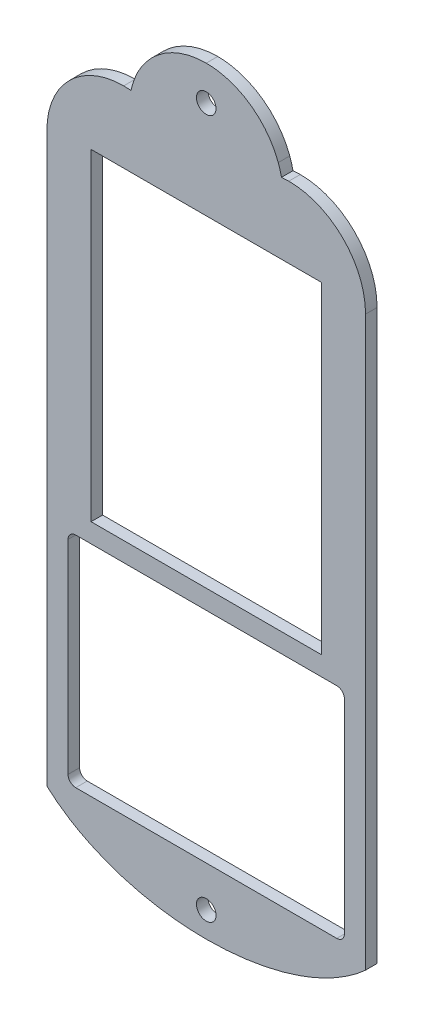
ISO-10303-21;
HEADER;
FILE_DESCRIPTION(('STEP AP214'),'2;1');
FILE_NAME('part.step','',(''),(''),'','','');
FILE_SCHEMA(('AUTOMOTIVE_DESIGN { 1 0 10303 214 1 1 1 1 }'));
ENDSEC;
DATA;
#1=APPLICATION_CONTEXT('core data for automotive mechanical design processes');
#2=APPLICATION_PROTOCOL_DEFINITION('international standard','automotive_design',2000,#1);
#3=PRODUCT_CONTEXT('',#1,'mechanical');
#4=PRODUCT('Part','Part','',(#3));
#5=PRODUCT_RELATED_PRODUCT_CATEGORY('part','',(#4));
#6=PRODUCT_DEFINITION_FORMATION('','',#4);
#7=PRODUCT_DEFINITION_CONTEXT('part definition',#1,'design');
#8=PRODUCT_DEFINITION('design','',#6,#7);
#9=PRODUCT_DEFINITION_SHAPE('','',#8);
#10=(LENGTH_UNIT() NAMED_UNIT(*) SI_UNIT(.MILLI.,.METRE.));
#11=(NAMED_UNIT(*) PLANE_ANGLE_UNIT() SI_UNIT($,.RADIAN.));
#12=(NAMED_UNIT(*) SI_UNIT($,.STERADIAN.) SOLID_ANGLE_UNIT());
#13=UNCERTAINTY_MEASURE_WITH_UNIT(LENGTH_MEASURE(1.E-05),#10,'distance_accuracy_value','');
#14=(GEOMETRIC_REPRESENTATION_CONTEXT(3) GLOBAL_UNCERTAINTY_ASSIGNED_CONTEXT((#13)) GLOBAL_UNIT_ASSIGNED_CONTEXT((#10,
#11,#12)) REPRESENTATION_CONTEXT('',''));
#15=CARTESIAN_POINT('',(0.,0.,0.));
#16=DIRECTION('',(0.,0.,1.));
#17=DIRECTION('',(1.,0.,0.));
#18=AXIS2_PLACEMENT_3D('',#15,#16,#17);
#19=CARTESIAN_POINT('',(-7.6058350285354,82.2924326123432,3.));
#20=DIRECTION('',(0.,0.,-1.));
#21=DIRECTION('',(-1.,0.,0.));
#22=AXIS2_PLACEMENT_3D('',#19,#20,#21);
#23=PLANE('',#22);
#24=DIRECTION('',(0.,-1.,0.));
#25=VECTOR('',#24,1.);
#26=CARTESIAN_POINT('',(-73.2491831836532,69.5718591249572,3.));
#27=LINE('',#26,#25);
#28=CARTESIAN_POINT('',(-73.2491831836532,69.5718591249572,3.));
#29=VERTEX_POINT('',#28);
#30=CARTESIAN_POINT('',(-73.2491831836531,-14.4281408750428,3.));
#31=VERTEX_POINT('',#30);
#32=EDGE_CURVE('E682',#29,#31,#27,.T.);
#33=ORIENTED_EDGE('',*,*,#32,.F.);
#34=DIRECTION('',(-1.,0.,0.));
#35=VECTOR('',#34,1.);
#36=CARTESIAN_POINT('',(-73.2491831836532,69.5718591249572,3.));
#37=LINE('',#36,#35);
#38=CARTESIAN_POINT('',(-13.2491831836531,69.5718591249572,3.));
#39=VERTEX_POINT('',#38);
#40=EDGE_CURVE('E692',#39,#29,#37,.T.);
#41=ORIENTED_EDGE('',*,*,#40,.F.);
#42=DIRECTION('',(0.,1.,0.));
#43=VECTOR('',#42,1.);
#44=CARTESIAN_POINT('',(-13.2491831836531,69.5718591249572,3.));
#45=LINE('',#44,#43);
#46=CARTESIAN_POINT('',(-13.2491831836531,-14.4281408750428,3.));
#47=VERTEX_POINT('',#46);
#48=EDGE_CURVE('E697',#47,#39,#45,.T.);
#49=ORIENTED_EDGE('',*,*,#48,.F.);
#50=DIRECTION('',(1.,0.,0.));
#51=VECTOR('',#50,1.);
#52=CARTESIAN_POINT('',(-73.2491831836531,-14.4281408750428,3.));
#53=LINE('',#52,#51);
#54=EDGE_CURVE('E685',#31,#47,#53,.T.);
#55=ORIENTED_EDGE('',*,*,#54,.F.);
#56=EDGE_LOOP('',(#33,#41,#49,#55));
#57=FACE_BOUND('',#56,.T.);
#58=CARTESIAN_POINT('',(-1.74840024860734,68.1508943137749,3.));
#59=CARTESIAN_POINT('',(-1.74840024860734,79.1963656719619,3.));
#60=CARTESIAN_POINT('',(-10.7019019689167,88.1498673922713,3.));
#61=CARTESIAN_POINT('',(-21.7473733271037,88.1498673922713,3.));
#62=B_SPLINE_CURVE_WITH_KNOTS('',3,(#58,#59,#60,#61),.UNSPECIFIED.,.F.,.F.,(4,4),(0.,1.),.UNSPECIFIED.);
#63=CARTESIAN_POINT('',(-1.74840024860734,68.1508943137749,3.));
#64=VERTEX_POINT('',#63);
#65=CARTESIAN_POINT('',(-21.7473733271037,88.1498673922713,3.));
#66=VERTEX_POINT('',#65);
#67=EDGE_CURVE('E293',#64,#66,#62,.T.);
#68=ORIENTED_EDGE('',*,*,#67,.T.);
#69=CARTESIAN_POINT('',(-21.7473733271037,88.1498673922713,3.));
#70=CARTESIAN_POINT('',(-22.3894314663204,88.1498673922713,3.));
#71=CARTESIAN_POINT('',(-23.0279583826646,88.1181294501134,3.));
#72=CARTESIAN_POINT('',(-23.6559131622385,88.0581417249765,3.));
#73=B_SPLINE_CURVE_WITH_KNOTS('',3,(#69,#70,#71,#72),.UNSPECIFIED.,.F.,.F.,(4,4),(1.,2.),.UNSPECIFIED.);
#74=CARTESIAN_POINT('',(-23.6559131622385,88.0581417249765,3.));
#75=VERTEX_POINT('',#74);
#76=EDGE_CURVE('E300',#66,#75,#73,.T.);
#77=ORIENTED_EDGE('',*,*,#76,.T.);
#78=CARTESIAN_POINT('',(-23.6559131622385,88.0581417249765,3.));
#79=CARTESIAN_POINT('',(-23.8605087703688,89.0565088647551,3.));
#80=CARTESIAN_POINT('',(-24.1427482179979,90.0301789762739,3.));
#81=CARTESIAN_POINT('',(-24.4884635499427,90.9720896137879,3.));
#82=B_SPLINE_CURVE_WITH_KNOTS('',3,(#78,#79,#80,#81),.UNSPECIFIED.,.F.,.F.,(4,4),(2.,3.),.UNSPECIFIED.);
#83=CARTESIAN_POINT('',(-24.4884635499427,90.9720896137879,3.));
#84=VERTEX_POINT('',#83);
#85=EDGE_CURVE('E319',#75,#84,#82,.T.);
#86=ORIENTED_EDGE('',*,*,#85,.T.);
#87=CARTESIAN_POINT('',(-24.4884635499427,90.9720896137879,3.));
#88=CARTESIAN_POINT('',(-27.3106857714594,98.592102530991,3.));
#89=CARTESIAN_POINT('',(-34.644928018161,104.024867388303,3.));
#90=CARTESIAN_POINT('',(-43.2491831836531,104.024867388303,3.));
#91=B_SPLINE_CURVE_WITH_KNOTS('',3,(#87,#88,#89,#90),.UNSPECIFIED.,.F.,.F.,(4,4),(3.,4.),.UNSPECIFIED.);
#92=CARTESIAN_POINT('',(-43.2491831836531,104.024867388303,3.));
#93=VERTEX_POINT('',#92);
#94=EDGE_CURVE('E324',#84,#93,#91,.T.);
#95=ORIENTED_EDGE('',*,*,#94,.T.);
#96=CARTESIAN_POINT('',(-43.2491831836531,104.024867388303,3.));
#97=CARTESIAN_POINT('',(-51.8534383491453,104.024867388303,3.));
#98=CARTESIAN_POINT('',(-59.1876805958469,98.592102530991,3.));
#99=CARTESIAN_POINT('',(-62.0099028173636,90.9720896137879,3.));
#100=B_SPLINE_CURVE_WITH_KNOTS('',3,(#96,#97,#98,#99),.UNSPECIFIED.,.F.,.F.,(4,4),(4.,5.),.UNSPECIFIED.);
#101=CARTESIAN_POINT('',(-62.0099028173636,90.9720896137879,3.));
#102=VERTEX_POINT('',#101);
#103=EDGE_CURVE('E456',#93,#102,#100,.T.);
#104=ORIENTED_EDGE('',*,*,#103,.T.);
#105=CARTESIAN_POINT('',(-62.0099028173636,90.9720896137879,3.));
#106=CARTESIAN_POINT('',(-62.3556396811552,90.0301789762739,3.));
#107=CARTESIAN_POINT('',(-62.6378575969375,89.0565088647551,3.));
#108=CARTESIAN_POINT('',(-62.8424532050678,88.0581417249765,3.));
#109=B_SPLINE_CURVE_WITH_KNOTS('',3,(#105,#106,#107,#108),.UNSPECIFIED.,.F.,.F.,(4,4),(5.,6.),.UNSPECIFIED.);
#110=CARTESIAN_POINT('',(-62.8424532050678,88.0581417249765,3.));
#111=VERTEX_POINT('',#110);
#112=EDGE_CURVE('E451',#102,#111,#109,.T.);
#113=ORIENTED_EDGE('',*,*,#112,.T.);
#114=CARTESIAN_POINT('',(-62.8424532050678,88.0581417249765,3.));
#115=CARTESIAN_POINT('',(-63.4704079846417,88.1181294501134,3.));
#116=CARTESIAN_POINT('',(-64.1054036781136,88.1498673922713,3.));
#117=CARTESIAN_POINT('',(-64.7474618173302,88.1498673922713,3.));
#118=B_SPLINE_CURVE_WITH_KNOTS('',3,(#114,#115,#116,#117),.UNSPECIFIED.,.F.,.F.,(4,4),(6.,7.),.UNSPECIFIED.);
#119=CARTESIAN_POINT('',(-64.7474618173302,88.1498673922713,3.));
#120=VERTEX_POINT('',#119);
#121=EDGE_CURVE('E438',#111,#120,#118,.T.);
#122=ORIENTED_EDGE('',*,*,#121,.T.);
#123=CARTESIAN_POINT('',(-64.7474618173302,88.1498673922713,3.));
#124=CARTESIAN_POINT('',(-75.7964643983896,88.1498673922713,3.));
#125=CARTESIAN_POINT('',(-84.749966118699,79.1963656719619,3.));
#126=CARTESIAN_POINT('',(-84.749966118699,68.1508943137749,3.));
#127=B_SPLINE_CURVE_WITH_KNOTS('',3,(#123,#124,#125,#126),.UNSPECIFIED.,.F.,.F.,(4,4),(7.,8.),.UNSPECIFIED.);
#128=CARTESIAN_POINT('',(-84.749966118699,68.1508943137749,3.));
#129=VERTEX_POINT('',#128);
#130=EDGE_CURVE('E432',#120,#129,#127,.T.);
#131=ORIENTED_EDGE('',*,*,#130,.T.);
#132=DIRECTION('',(0.,-1.,0.));
#133=VECTOR('',#132,1.);
#134=CARTESIAN_POINT('',(-84.749966118699,68.1508943137749,3.));
#135=LINE('',#134,#133);
#136=CARTESIAN_POINT('',(-84.7499661186989,-79.8491056862251,3.));
#137=VERTEX_POINT('',#136);
#138=EDGE_CURVE('E437',#129,#137,#135,.T.);
#139=ORIENTED_EDGE('',*,*,#138,.T.);
#140=CARTESIAN_POINT('',(-84.7499661186989,-79.8491056862251,3.));
#141=CARTESIAN_POINT('',(-81.6384635356552,-82.6924937131293,3.));
#142=CARTESIAN_POINT('',(-77.8178741743599,-85.1972288538334,3.));
#143=CARTESIAN_POINT('',(-73.4469523411428,-87.2680326863235,3.));
#144=B_SPLINE_CURVE_WITH_KNOTS('',3,(#140,#141,#142,#143),.UNSPECIFIED.,.F.,.F.,(4,4),(11.,12.),.UNSPECIFIED.);
#145=CARTESIAN_POINT('',(-73.4469523411428,-87.2680326863235,3.));
#146=VERTEX_POINT('',#145);
#147=EDGE_CURVE('E403',#137,#146,#144,.T.);
#148=ORIENTED_EDGE('',*,*,#147,.T.);
#149=CARTESIAN_POINT('',(-73.4469523411428,-87.2680326863235,3.));
#150=CARTESIAN_POINT('',(-65.0296797331125,-91.2579484907188,3.));
#151=CARTESIAN_POINT('',(-54.5733412347501,-93.618032684736,3.));
#152=CARTESIAN_POINT('',(-43.2491831836531,-93.618032684736,3.));
#153=B_SPLINE_CURVE_WITH_KNOTS('',3,(#149,#150,#151,#152),.UNSPECIFIED.,.F.,.F.,(4,4),(12.,13.),.UNSPECIFIED.);
#154=CARTESIAN_POINT('',(-43.2491831836531,-93.618032684736,3.));
#155=VERTEX_POINT('',#154);
#156=EDGE_CURVE('E398',#146,#155,#153,.T.);
#157=ORIENTED_EDGE('',*,*,#156,.T.);
#158=CARTESIAN_POINT('',(-43.2491831836531,-93.618032684736,3.));
#159=CARTESIAN_POINT('',(-31.9250251325562,-93.618032684736,3.));
#160=CARTESIAN_POINT('',(-21.4686866341937,-91.2579484907188,3.));
#161=CARTESIAN_POINT('',(-13.0514140261635,-87.2680326863235,3.));
#162=B_SPLINE_CURVE_WITH_KNOTS('',3,(#158,#159,#160,#161),.UNSPECIFIED.,.F.,.F.,(4,4),(13.,14.),.UNSPECIFIED.);
#163=CARTESIAN_POINT('',(-13.0514140261635,-87.2680326863235,3.));
#164=VERTEX_POINT('',#163);
#165=EDGE_CURVE('E381',#155,#164,#162,.T.);
#166=ORIENTED_EDGE('',*,*,#165,.T.);
#167=CARTESIAN_POINT('',(-13.0514140261635,-87.2680326863235,3.));
#168=CARTESIAN_POINT('',(-8.68049219294634,-85.1972288538334,3.));
#169=CARTESIAN_POINT('',(-4.85990283165106,-82.6924937131293,3.));
#170=CARTESIAN_POINT('',(-1.74840024860732,-79.8491056862251,3.));
#171=B_SPLINE_CURVE_WITH_KNOTS('',3,(#167,#168,#169,#170),.UNSPECIFIED.,.F.,.F.,(4,4),(14.,15.),.UNSPECIFIED.);
#172=CARTESIAN_POINT('',(-1.74840024860732,-79.8491056862251,3.));
#173=VERTEX_POINT('',#172);
#174=EDGE_CURVE('E374',#164,#173,#171,.T.);
#175=ORIENTED_EDGE('',*,*,#174,.T.);
#176=DIRECTION('',(0.,1.,0.));
#177=VECTOR('',#176,1.);
#178=CARTESIAN_POINT('',(-1.74840024860734,68.1508943137749,3.));
#179=LINE('',#178,#177);
#180=EDGE_CURVE('E380',#173,#64,#179,.T.);
#181=ORIENTED_EDGE('',*,*,#180,.T.);
#182=EDGE_LOOP('',(#68,#77,#86,#95,#104,#113,#122,#131,#139,#148,#157,#166,#175,#181));
#183=FACE_BOUND('',#182,.T.);
#184=CARTESIAN_POINT('',(-43.2491831836531,95.0101030947806,3.));
#185=DIRECTION('',(0.,0.,1.));
#186=DIRECTION('',(1.,0.,0.));
#187=AXIS2_PLACEMENT_3D('',#184,#185,#186);
#188=CIRCLE('',#187,2.55);
#189=CARTESIAN_POINT('',(-40.6991831836531,95.0101030947806,3.));
#190=VERTEX_POINT('',#189);
#191=EDGE_CURVE('E286',#190,#190,#188,.T.);
#192=ORIENTED_EDGE('',*,*,#191,.F.);
#193=EDGE_LOOP('',(#192));
#194=FACE_BOUND('',#193,.T.);
#195=CARTESIAN_POINT('',(-43.2491831836531,-86.9898969052195,3.));
#196=DIRECTION('',(0.,0.,1.));
#197=DIRECTION('',(1.,0.,0.));
#198=AXIS2_PLACEMENT_3D('',#195,#196,#197);
#199=CIRCLE('',#198,2.54999999999999);
#200=CARTESIAN_POINT('',(-40.6991831836532,-86.9898969052195,3.));
#201=VERTEX_POINT('',#200);
#202=EDGE_CURVE('E275',#201,#201,#199,.T.);
#203=ORIENTED_EDGE('',*,*,#202,.F.);
#204=EDGE_LOOP('',(#203));
#205=FACE_BOUND('',#204,.T.);
#206=CARTESIAN_POINT('',(-77.2491831836531,-74.4281408750428,3.));
#207=DIRECTION('',(0.,0.,1.));
#208=DIRECTION('',(1.,0.,0.));
#209=AXIS2_PLACEMENT_3D('',#206,#207,#208);
#210=CIRCLE('',#209,2.);
#211=CARTESIAN_POINT('',(-79.2491831836531,-74.4281408750428,3.));
#212=VERTEX_POINT('',#211);
#213=CARTESIAN_POINT('',(-77.2491831836531,-76.4281408750428,3.));
#214=VERTEX_POINT('',#213);
#215=EDGE_CURVE('E216',#212,#214,#210,.T.);
#216=ORIENTED_EDGE('',*,*,#215,.F.);
#217=DIRECTION('',(0.,-1.,0.));
#218=VECTOR('',#217,1.);
#219=CARTESIAN_POINT('',(-79.2491831836531,-21.4281408750428,3.));
#220=LINE('',#219,#218);
#221=CARTESIAN_POINT('',(-79.2491831836531,-21.4281408750428,3.));
#222=VERTEX_POINT('',#221);
#223=EDGE_CURVE('E265',#222,#212,#220,.T.);
#224=ORIENTED_EDGE('',*,*,#223,.F.);
#225=CARTESIAN_POINT('',(-77.2491831836531,-21.4281408750428,3.));
#226=DIRECTION('',(0.,0.,1.));
#227=DIRECTION('',(1.,0.,0.));
#228=AXIS2_PLACEMENT_3D('',#225,#226,#227);
#229=CIRCLE('',#228,2.);
#230=CARTESIAN_POINT('',(-77.2491831836531,-19.4281408750428,3.));
#231=VERTEX_POINT('',#230);
#232=EDGE_CURVE('E261',#231,#222,#229,.T.);
#233=ORIENTED_EDGE('',*,*,#232,.F.);
#234=DIRECTION('',(-1.,0.,0.));
#235=VECTOR('',#234,1.);
#236=CARTESIAN_POINT('',(-77.2491831836531,-19.4281408750428,3.));
#237=LINE('',#236,#235);
#238=CARTESIAN_POINT('',(-9.24918318365314,-19.4281408750428,3.));
#239=VERTEX_POINT('',#238);
#240=EDGE_CURVE('E257',#239,#231,#237,.T.);
#241=ORIENTED_EDGE('',*,*,#240,.F.);
#242=CARTESIAN_POINT('',(-9.24918318365313,-21.4281408750428,3.));
#243=DIRECTION('',(0.,0.,1.));
#244=DIRECTION('',(-1.,0.,0.));
#245=AXIS2_PLACEMENT_3D('',#242,#243,#244);
#246=CIRCLE('',#245,2.);
#247=CARTESIAN_POINT('',(-7.24918318365313,-21.4281408750428,3.));
#248=VERTEX_POINT('',#247);
#249=EDGE_CURVE('E254',#248,#239,#246,.T.);
#250=ORIENTED_EDGE('',*,*,#249,.F.);
#251=DIRECTION('',(0.,1.,0.));
#252=VECTOR('',#251,1.);
#253=CARTESIAN_POINT('',(-7.24918318365313,-21.4281408750428,3.));
#254=LINE('',#253,#252);
#255=CARTESIAN_POINT('',(-7.24918318365311,-74.4281408750428,3.));
#256=VERTEX_POINT('',#255);
#257=EDGE_CURVE('E241',#256,#248,#254,.T.);
#258=ORIENTED_EDGE('',*,*,#257,.F.);
#259=CARTESIAN_POINT('',(-9.24918318365311,-74.4281408750428,3.));
#260=DIRECTION('',(0.,0.,1.));
#261=DIRECTION('',(1.,0.,0.));
#262=AXIS2_PLACEMENT_3D('',#259,#260,#261);
#263=CIRCLE('',#262,2.);
#264=CARTESIAN_POINT('',(-9.24918318365313,-76.4281408750428,3.));
#265=VERTEX_POINT('',#264);
#266=EDGE_CURVE('E238',#265,#256,#263,.T.);
#267=ORIENTED_EDGE('',*,*,#266,.F.);
#268=DIRECTION('',(1.,0.,0.));
#269=VECTOR('',#268,1.);
#270=CARTESIAN_POINT('',(-77.2491831836531,-76.4281408750428,3.));
#271=LINE('',#270,#269);
#272=EDGE_CURVE('E225',#214,#265,#271,.T.);
#273=ORIENTED_EDGE('',*,*,#272,.F.);
#274=EDGE_LOOP('',(#216,#224,#233,#241,#250,#258,#267,#273));
#275=FACE_BOUND('',#274,.T.);
#276=ADVANCED_FACE('F42',(#57,#183,#194,#205,#275),#23,.F.);
#277=CARTESIAN_POINT('',(-7.6058350285354,82.2924326123432,0.));
#278=DIRECTION('',(0.,0.,-1.));
#279=DIRECTION('',(-1.,0.,0.));
#280=AXIS2_PLACEMENT_3D('',#277,#278,#279);
#281=PLANE('',#280);
#282=CARTESIAN_POINT('',(-43.2491831836531,95.0101030947806,0.));
#283=DIRECTION('',(0.,0.,1.));
#284=DIRECTION('',(1.,0.,0.));
#285=AXIS2_PLACEMENT_3D('',#282,#283,#284);
#286=CIRCLE('',#285,2.55);
#287=CARTESIAN_POINT('',(-40.6991831836531,95.0101030947806,0.));
#288=VERTEX_POINT('',#287);
#289=EDGE_CURVE('E281',#288,#288,#286,.T.);
#290=ORIENTED_EDGE('',*,*,#289,.T.);
#291=EDGE_LOOP('',(#290));
#292=FACE_BOUND('',#291,.T.);
#293=CARTESIAN_POINT('',(-1.74840024860734,68.1508943137749,0.));
#294=CARTESIAN_POINT('',(-1.74840024860734,79.1963656719619,0.));
#295=CARTESIAN_POINT('',(-10.7019019689167,88.1498673922713,0.));
#296=CARTESIAN_POINT('',(-21.7473733271037,88.1498673922713,0.));
#297=B_SPLINE_CURVE_WITH_KNOTS('',3,(#293,#294,#295,#296),.UNSPECIFIED.,.F.,.F.,(4,4),(0.,1.),.UNSPECIFIED.);
#298=CARTESIAN_POINT('',(-1.74840024860734,68.1508943137749,0.));
#299=VERTEX_POINT('',#298);
#300=CARTESIAN_POINT('',(-21.7473733271037,88.1498673922713,0.));
#301=VERTEX_POINT('',#300);
#302=EDGE_CURVE('E291',#299,#301,#297,.T.);
#303=ORIENTED_EDGE('',*,*,#302,.F.);
#304=DIRECTION('',(0.,1.,0.));
#305=VECTOR('',#304,1.);
#306=CARTESIAN_POINT('',(-1.74840024860734,68.1508943137749,0.));
#307=LINE('',#306,#305);
#308=CARTESIAN_POINT('',(-1.74840024860732,-79.8491056862251,0.));
#309=VERTEX_POINT('',#308);
#310=EDGE_CURVE('E301',#309,#299,#307,.T.);
#311=ORIENTED_EDGE('',*,*,#310,.F.);
#312=CARTESIAN_POINT('',(-13.0514140261635,-87.2680326863235,0.));
#313=CARTESIAN_POINT('',(-8.68049219294634,-85.1972288538334,0.));
#314=CARTESIAN_POINT('',(-4.85990283165106,-82.6924937131293,0.));
#315=CARTESIAN_POINT('',(-1.74840024860732,-79.8491056862251,0.));
#316=B_SPLINE_CURVE_WITH_KNOTS('',3,(#312,#313,#314,#315),.UNSPECIFIED.,.F.,.F.,(4,4),(14.,15.),.UNSPECIFIED.);
#317=CARTESIAN_POINT('',(-13.0514140261635,-87.2680326863235,0.));
#318=VERTEX_POINT('',#317);
#319=EDGE_CURVE('E542',#318,#309,#316,.T.);
#320=ORIENTED_EDGE('',*,*,#319,.F.);
#321=CARTESIAN_POINT('',(-43.2491831836531,-93.618032684736,0.));
#322=CARTESIAN_POINT('',(-31.9250251325562,-93.618032684736,0.));
#323=CARTESIAN_POINT('',(-21.4686866341937,-91.2579484907188,0.));
#324=CARTESIAN_POINT('',(-13.0514140261635,-87.2680326863235,0.));
#325=B_SPLINE_CURVE_WITH_KNOTS('',3,(#321,#322,#323,#324),.UNSPECIFIED.,.F.,.F.,(4,4),(13.,14.),.UNSPECIFIED.);
#326=CARTESIAN_POINT('',(-43.2491831836531,-93.618032684736,0.));
#327=VERTEX_POINT('',#326);
#328=EDGE_CURVE('E535',#327,#318,#325,.T.);
#329=ORIENTED_EDGE('',*,*,#328,.F.);
#330=CARTESIAN_POINT('',(-73.4469523411428,-87.2680326863235,0.));
#331=CARTESIAN_POINT('',(-65.0296797331125,-91.2579484907188,0.));
#332=CARTESIAN_POINT('',(-54.5733412347501,-93.618032684736,0.));
#333=CARTESIAN_POINT('',(-43.2491831836531,-93.618032684736,0.));
#334=B_SPLINE_CURVE_WITH_KNOTS('',3,(#330,#331,#332,#333),.UNSPECIFIED.,.F.,.F.,(4,4),(12.,13.),.UNSPECIFIED.);
#335=CARTESIAN_POINT('',(-73.4469523411428,-87.2680326863235,0.));
#336=VERTEX_POINT('',#335);
#337=EDGE_CURVE('E528',#336,#327,#334,.T.);
#338=ORIENTED_EDGE('',*,*,#337,.F.);
#339=CARTESIAN_POINT('',(-84.7499661186989,-79.8491056862251,0.));
#340=CARTESIAN_POINT('',(-81.6384635356552,-82.6924937131293,0.));
#341=CARTESIAN_POINT('',(-77.8178741743599,-85.1972288538334,0.));
#342=CARTESIAN_POINT('',(-73.4469523411428,-87.2680326863235,0.));
#343=B_SPLINE_CURVE_WITH_KNOTS('',3,(#339,#340,#341,#342),.UNSPECIFIED.,.F.,.F.,(4,4),(11.,12.),.UNSPECIFIED.);
#344=CARTESIAN_POINT('',(-84.7499661186989,-79.8491056862251,0.));
#345=VERTEX_POINT('',#344);
#346=EDGE_CURVE('E524',#345,#336,#343,.T.);
#347=ORIENTED_EDGE('',*,*,#346,.F.);
#348=DIRECTION('',(0.,-1.,0.));
#349=VECTOR('',#348,1.);
#350=CARTESIAN_POINT('',(-84.749966118699,68.1508943137749,0.));
#351=LINE('',#350,#349);
#352=CARTESIAN_POINT('',(-84.749966118699,68.1508943137749,0.));
#353=VERTEX_POINT('',#352);
#354=EDGE_CURVE('E519',#353,#345,#351,.T.);
#355=ORIENTED_EDGE('',*,*,#354,.F.);
#356=CARTESIAN_POINT('',(-64.7474618173302,88.1498673922713,0.));
#357=CARTESIAN_POINT('',(-75.7964643983896,88.1498673922713,0.));
#358=CARTESIAN_POINT('',(-84.749966118699,79.1963656719619,0.));
#359=CARTESIAN_POINT('',(-84.749966118699,68.1508943137749,0.));
#360=B_SPLINE_CURVE_WITH_KNOTS('',3,(#356,#357,#358,#359),.UNSPECIFIED.,.F.,.F.,(4,4),(7.,8.),.UNSPECIFIED.);
#361=CARTESIAN_POINT('',(-64.7474618173302,88.1498673922713,0.));
#362=VERTEX_POINT('',#361);
#363=EDGE_CURVE('E500',#362,#353,#360,.T.);
#364=ORIENTED_EDGE('',*,*,#363,.F.);
#365=CARTESIAN_POINT('',(-62.8424532050678,88.0581417249765,0.));
#366=CARTESIAN_POINT('',(-63.4704079846417,88.1181294501134,0.));
#367=CARTESIAN_POINT('',(-64.1054036781136,88.1498673922713,0.));
#368=CARTESIAN_POINT('',(-64.7474618173302,88.1498673922713,0.));
#369=B_SPLINE_CURVE_WITH_KNOTS('',3,(#365,#366,#367,#368),.UNSPECIFIED.,.F.,.F.,(4,4),(6.,7.),.UNSPECIFIED.);
#370=CARTESIAN_POINT('',(-62.8424532050678,88.0581417249765,0.));
#371=VERTEX_POINT('',#370);
#372=EDGE_CURVE('E498',#371,#362,#369,.T.);
#373=ORIENTED_EDGE('',*,*,#372,.F.);
#374=CARTESIAN_POINT('',(-62.0099028173636,90.9720896137879,0.));
#375=CARTESIAN_POINT('',(-62.3556396811552,90.0301789762739,0.));
#376=CARTESIAN_POINT('',(-62.6378575969375,89.0565088647551,0.));
#377=CARTESIAN_POINT('',(-62.8424532050678,88.0581417249765,0.));
#378=B_SPLINE_CURVE_WITH_KNOTS('',3,(#374,#375,#376,#377),.UNSPECIFIED.,.F.,.F.,(4,4),(5.,6.),.UNSPECIFIED.);
#379=CARTESIAN_POINT('',(-62.0099028173636,90.9720896137879,0.));
#380=VERTEX_POINT('',#379);
#381=EDGE_CURVE('E487',#380,#371,#378,.T.);
#382=ORIENTED_EDGE('',*,*,#381,.F.);
#383=CARTESIAN_POINT('',(-43.2491831836531,104.024867388303,0.));
#384=CARTESIAN_POINT('',(-51.8534383491453,104.024867388303,0.));
#385=CARTESIAN_POINT('',(-59.1876805958469,98.592102530991,0.));
#386=CARTESIAN_POINT('',(-62.0099028173636,90.9720896137879,0.));
#387=B_SPLINE_CURVE_WITH_KNOTS('',3,(#383,#384,#385,#386),.UNSPECIFIED.,.F.,.F.,(4,4),(4.,5.),.UNSPECIFIED.);
#388=CARTESIAN_POINT('',(-43.2491831836531,104.024867388303,0.));
#389=VERTEX_POINT('',#388);
#390=EDGE_CURVE('E477',#389,#380,#387,.T.);
#391=ORIENTED_EDGE('',*,*,#390,.F.);
#392=CARTESIAN_POINT('',(-24.4884635499427,90.9720896137879,0.));
#393=CARTESIAN_POINT('',(-27.3106857714594,98.592102530991,0.));
#394=CARTESIAN_POINT('',(-34.644928018161,104.024867388303,0.));
#395=CARTESIAN_POINT('',(-43.2491831836531,104.024867388303,0.));
#396=B_SPLINE_CURVE_WITH_KNOTS('',3,(#392,#393,#394,#395),.UNSPECIFIED.,.F.,.F.,(4,4),(3.,4.),.UNSPECIFIED.);
#397=CARTESIAN_POINT('',(-24.4884635499427,90.9720896137879,0.));
#398=VERTEX_POINT('',#397);
#399=EDGE_CURVE('E488',#398,#389,#396,.T.);
#400=ORIENTED_EDGE('',*,*,#399,.F.);
#401=CARTESIAN_POINT('',(-23.6559131622385,88.0581417249765,0.));
#402=CARTESIAN_POINT('',(-23.8605087703688,89.0565088647551,0.));
#403=CARTESIAN_POINT('',(-24.1427482179979,90.0301789762739,0.));
#404=CARTESIAN_POINT('',(-24.4884635499427,90.9720896137879,0.));
#405=B_SPLINE_CURVE_WITH_KNOTS('',3,(#401,#402,#403,#404),.UNSPECIFIED.,.F.,.F.,(4,4),(2.,3.),.UNSPECIFIED.);
#406=CARTESIAN_POINT('',(-23.6559131622385,88.0581417249765,0.));
#407=VERTEX_POINT('',#406);
#408=EDGE_CURVE('E586',#407,#398,#405,.T.);
#409=ORIENTED_EDGE('',*,*,#408,.F.);
#410=CARTESIAN_POINT('',(-21.7473733271037,88.1498673922713,0.));
#411=CARTESIAN_POINT('',(-22.3894314663204,88.1498673922713,0.));
#412=CARTESIAN_POINT('',(-23.0279583826646,88.1181294501134,0.));
#413=CARTESIAN_POINT('',(-23.6559131622385,88.0581417249765,0.));
#414=B_SPLINE_CURVE_WITH_KNOTS('',3,(#410,#411,#412,#413),.UNSPECIFIED.,.F.,.F.,(4,4),(1.,2.),.UNSPECIFIED.);
#415=EDGE_CURVE('E587',#301,#407,#414,.T.);
#416=ORIENTED_EDGE('',*,*,#415,.F.);
#417=EDGE_LOOP('',(#303,#311,#320,#329,#338,#347,#355,#364,#373,#382,#391,#400,#409,#416));
#418=FACE_BOUND('',#417,.T.);
#419=CARTESIAN_POINT('',(-43.2491831836531,-86.9898969052195,0.));
#420=DIRECTION('',(0.,0.,1.));
#421=DIRECTION('',(1.,0.,0.));
#422=AXIS2_PLACEMENT_3D('',#419,#420,#421);
#423=CIRCLE('',#422,2.54999999999999);
#424=CARTESIAN_POINT('',(-40.6991831836532,-86.9898969052195,0.));
#425=VERTEX_POINT('',#424);
#426=EDGE_CURVE('E282',#425,#425,#423,.T.);
#427=ORIENTED_EDGE('',*,*,#426,.T.);
#428=EDGE_LOOP('',(#427));
#429=FACE_BOUND('',#428,.T.);
#430=DIRECTION('',(-1.,0.,0.));
#431=VECTOR('',#430,1.);
#432=CARTESIAN_POINT('',(-73.2491831836532,69.5718591249572,0.));
#433=LINE('',#432,#431);
#434=CARTESIAN_POINT('',(-13.2491831836531,69.5718591249572,0.));
#435=VERTEX_POINT('',#434);
#436=CARTESIAN_POINT('',(-73.2491831836532,69.5718591249572,0.));
#437=VERTEX_POINT('',#436);
#438=EDGE_CURVE('E686',#435,#437,#433,.T.);
#439=ORIENTED_EDGE('',*,*,#438,.T.);
#440=DIRECTION('',(0.,-1.,0.));
#441=VECTOR('',#440,1.);
#442=CARTESIAN_POINT('',(-73.2491831836532,69.5718591249572,0.));
#443=LINE('',#442,#441);
#444=CARTESIAN_POINT('',(-73.2491831836531,-14.4281408750428,0.));
#445=VERTEX_POINT('',#444);
#446=EDGE_CURVE('E233',#437,#445,#443,.T.);
#447=ORIENTED_EDGE('',*,*,#446,.T.);
#448=DIRECTION('',(1.,0.,0.));
#449=VECTOR('',#448,1.);
#450=CARTESIAN_POINT('',(-73.2491831836531,-14.4281408750428,0.));
#451=LINE('',#450,#449);
#452=CARTESIAN_POINT('',(-13.2491831836531,-14.4281408750428,0.));
#453=VERTEX_POINT('',#452);
#454=EDGE_CURVE('E701',#445,#453,#451,.T.);
#455=ORIENTED_EDGE('',*,*,#454,.T.);
#456=DIRECTION('',(0.,1.,0.));
#457=VECTOR('',#456,1.);
#458=CARTESIAN_POINT('',(-13.2491831836531,69.5718591249572,0.));
#459=LINE('',#458,#457);
#460=EDGE_CURVE('E704',#453,#435,#459,.T.);
#461=ORIENTED_EDGE('',*,*,#460,.T.);
#462=EDGE_LOOP('',(#439,#447,#455,#461));
#463=FACE_BOUND('',#462,.T.);
#464=DIRECTION('',(0.,-1.,0.));
#465=VECTOR('',#464,1.);
#466=CARTESIAN_POINT('',(-79.2491831836531,-21.4281408750428,0.));
#467=LINE('',#466,#465);
#468=CARTESIAN_POINT('',(-79.2491831836531,-21.4281408750428,0.));
#469=VERTEX_POINT('',#468);
#470=CARTESIAN_POINT('',(-79.2491831836531,-74.4281408750428,0.));
#471=VERTEX_POINT('',#470);
#472=EDGE_CURVE('E226',#469,#471,#467,.T.);
#473=ORIENTED_EDGE('',*,*,#472,.T.);
#474=CARTESIAN_POINT('',(-77.2491831836531,-74.4281408750428,0.));
#475=DIRECTION('',(0.,0.,1.));
#476=DIRECTION('',(1.,0.,0.));
#477=AXIS2_PLACEMENT_3D('',#474,#475,#476);
#478=CIRCLE('',#477,2.);
#479=CARTESIAN_POINT('',(-77.2491831836531,-76.4281408750428,0.));
#480=VERTEX_POINT('',#479);
#481=EDGE_CURVE('E66',#471,#480,#478,.T.);
#482=ORIENTED_EDGE('',*,*,#481,.T.);
#483=DIRECTION('',(1.,0.,0.));
#484=VECTOR('',#483,1.);
#485=CARTESIAN_POINT('',(-77.2491831836531,-76.4281408750428,0.));
#486=LINE('',#485,#484);
#487=CARTESIAN_POINT('',(-9.24918318365313,-76.4281408750428,0.));
#488=VERTEX_POINT('',#487);
#489=EDGE_CURVE('E232',#480,#488,#486,.T.);
#490=ORIENTED_EDGE('',*,*,#489,.T.);
#491=CARTESIAN_POINT('',(-9.24918318365311,-74.4281408750428,0.));
#492=DIRECTION('',(0.,0.,1.));
#493=DIRECTION('',(1.,0.,0.));
#494=AXIS2_PLACEMENT_3D('',#491,#492,#493);
#495=CIRCLE('',#494,2.);
#496=CARTESIAN_POINT('',(-7.24918318365311,-74.4281408750428,0.));
#497=VERTEX_POINT('',#496);
#498=EDGE_CURVE('E1020',#488,#497,#495,.T.);
#499=ORIENTED_EDGE('',*,*,#498,.T.);
#500=DIRECTION('',(0.,1.,0.));
#501=VECTOR('',#500,1.);
#502=CARTESIAN_POINT('',(-7.24918318365313,-21.4281408750428,0.));
#503=LINE('',#502,#501);
#504=CARTESIAN_POINT('',(-7.24918318365313,-21.4281408750428,0.));
#505=VERTEX_POINT('',#504);
#506=EDGE_CURVE('E1018',#497,#505,#503,.T.);
#507=ORIENTED_EDGE('',*,*,#506,.T.);
#508=CARTESIAN_POINT('',(-9.24918318365313,-21.4281408750428,0.));
#509=DIRECTION('',(0.,0.,1.));
#510=DIRECTION('',(-1.,0.,0.));
#511=AXIS2_PLACEMENT_3D('',#508,#509,#510);
#512=CIRCLE('',#511,2.);
#513=CARTESIAN_POINT('',(-9.24918318365314,-19.4281408750428,0.));
#514=VERTEX_POINT('',#513);
#515=EDGE_CURVE('E658',#505,#514,#512,.T.);
#516=ORIENTED_EDGE('',*,*,#515,.T.);
#517=DIRECTION('',(-1.,0.,0.));
#518=VECTOR('',#517,1.);
#519=CARTESIAN_POINT('',(-77.2491831836531,-19.4281408750428,0.));
#520=LINE('',#519,#518);
#521=CARTESIAN_POINT('',(-77.2491831836531,-19.4281408750428,0.));
#522=VERTEX_POINT('',#521);
#523=EDGE_CURVE('E1013',#514,#522,#520,.T.);
#524=ORIENTED_EDGE('',*,*,#523,.T.);
#525=CARTESIAN_POINT('',(-77.2491831836531,-21.4281408750428,0.));
#526=DIRECTION('',(0.,0.,1.));
#527=DIRECTION('',(1.,0.,0.));
#528=AXIS2_PLACEMENT_3D('',#525,#526,#527);
#529=CIRCLE('',#528,2.);
#530=EDGE_CURVE('E673',#522,#469,#529,.T.);
#531=ORIENTED_EDGE('',*,*,#530,.T.);
#532=EDGE_LOOP('',(#473,#482,#490,#499,#507,#516,#524,#531));
#533=FACE_BOUND('',#532,.T.);
#534=ADVANCED_FACE('F346',(#292,#418,#429,#463,#533),#281,.T.);
#535=DIRECTION('',(0.,0.,-1.));
#536=VECTOR('',#535,1.);
#537=SURFACE_OF_LINEAR_EXTRUSION('',#62,#536);
#538=ORIENTED_EDGE('',*,*,#302,.T.);
#539=DIRECTION('',(0.,0.,-1.));
#540=VECTOR('',#539,1.);
#541=CARTESIAN_POINT('',(-21.7473733271037,88.1498673922713,3.));
#542=LINE('',#541,#540);
#543=EDGE_CURVE('E12',#66,#301,#542,.T.);
#544=ORIENTED_EDGE('',*,*,#543,.F.);
#545=ORIENTED_EDGE('',*,*,#67,.F.);
#546=DIRECTION('',(0.,0.,-1.));
#547=VECTOR('',#546,1.);
#548=CARTESIAN_POINT('',(-1.74840024860734,68.1508943137749,3.));
#549=LINE('',#548,#547);
#550=EDGE_CURVE('E553',#64,#299,#549,.T.);
#551=ORIENTED_EDGE('',*,*,#550,.T.);
#552=EDGE_LOOP('',(#538,#544,#545,#551));
#553=FACE_BOUND('',#552,.T.);
#554=ADVANCED_FACE('F44',(#553),#537,.F.);
#555=DIRECTION('',(0.,0.,-1.));
#556=VECTOR('',#555,1.);
#557=SURFACE_OF_LINEAR_EXTRUSION('',#73,#556);
#558=ORIENTED_EDGE('',*,*,#415,.T.);
#559=DIRECTION('',(0.,0.,-1.));
#560=VECTOR('',#559,1.);
#561=CARTESIAN_POINT('',(-23.6559131622385,88.0581417249765,3.));
#562=LINE('',#561,#560);
#563=EDGE_CURVE('E51',#75,#407,#562,.T.);
#564=ORIENTED_EDGE('',*,*,#563,.F.);
#565=ORIENTED_EDGE('',*,*,#76,.F.);
#566=ORIENTED_EDGE('',*,*,#543,.T.);
#567=EDGE_LOOP('',(#558,#564,#565,#566));
#568=FACE_BOUND('',#567,.T.);
#569=ADVANCED_FACE('F338',(#568),#557,.F.);
#570=DIRECTION('',(0.,0.,-1.));
#571=VECTOR('',#570,1.);
#572=SURFACE_OF_LINEAR_EXTRUSION('',#82,#571);
#573=ORIENTED_EDGE('',*,*,#408,.T.);
#574=DIRECTION('',(0.,0.,-1.));
#575=VECTOR('',#574,1.);
#576=CARTESIAN_POINT('',(-24.4884635499427,90.9720896137879,3.));
#577=LINE('',#576,#575);
#578=EDGE_CURVE('E579',#84,#398,#577,.T.);
#579=ORIENTED_EDGE('',*,*,#578,.F.);
#580=ORIENTED_EDGE('',*,*,#85,.F.);
#581=ORIENTED_EDGE('',*,*,#563,.T.);
#582=EDGE_LOOP('',(#573,#579,#580,#581));
#583=FACE_BOUND('',#582,.T.);
#584=ADVANCED_FACE('F334',(#583),#572,.F.);
#585=DIRECTION('',(0.,0.,-1.));
#586=VECTOR('',#585,1.);
#587=SURFACE_OF_LINEAR_EXTRUSION('',#91,#586);
#588=ORIENTED_EDGE('',*,*,#399,.T.);
#589=DIRECTION('',(0.,0.,-1.));
#590=VECTOR('',#589,1.);
#591=CARTESIAN_POINT('',(-43.2491831836531,104.024867388303,3.));
#592=LINE('',#591,#590);
#593=EDGE_CURVE('E483',#93,#389,#592,.T.);
#594=ORIENTED_EDGE('',*,*,#593,.F.);
#595=ORIENTED_EDGE('',*,*,#94,.F.);
#596=ORIENTED_EDGE('',*,*,#578,.T.);
#597=EDGE_LOOP('',(#588,#594,#595,#596));
#598=FACE_BOUND('',#597,.T.);
#599=ADVANCED_FACE('F337',(#598),#587,.F.);
#600=DIRECTION('',(0.,0.,-1.));
#601=VECTOR('',#600,1.);
#602=SURFACE_OF_LINEAR_EXTRUSION('',#100,#601);
#603=ORIENTED_EDGE('',*,*,#390,.T.);
#604=DIRECTION('',(0.,0.,-1.));
#605=VECTOR('',#604,1.);
#606=CARTESIAN_POINT('',(-62.0099028173636,90.9720896137879,3.));
#607=LINE('',#606,#605);
#608=EDGE_CURVE('E480',#102,#380,#607,.T.);
#609=ORIENTED_EDGE('',*,*,#608,.F.);
#610=ORIENTED_EDGE('',*,*,#103,.F.);
#611=ORIENTED_EDGE('',*,*,#593,.T.);
#612=EDGE_LOOP('',(#603,#609,#610,#611));
#613=FACE_BOUND('',#612,.T.);
#614=ADVANCED_FACE('F466',(#613),#602,.F.);
#615=DIRECTION('',(0.,0.,-1.));
#616=VECTOR('',#615,1.);
#617=SURFACE_OF_LINEAR_EXTRUSION('',#109,#616);
#618=ORIENTED_EDGE('',*,*,#381,.T.);
#619=DIRECTION('',(0.,0.,-1.));
#620=VECTOR('',#619,1.);
#621=CARTESIAN_POINT('',(-62.8424532050678,88.0581417249765,3.));
#622=LINE('',#621,#620);
#623=EDGE_CURVE('E492',#111,#371,#622,.T.);
#624=ORIENTED_EDGE('',*,*,#623,.F.);
#625=ORIENTED_EDGE('',*,*,#112,.F.);
#626=ORIENTED_EDGE('',*,*,#608,.T.);
#627=EDGE_LOOP('',(#618,#624,#625,#626));
#628=FACE_BOUND('',#627,.T.);
#629=ADVANCED_FACE('F464',(#628),#617,.F.);
#630=DIRECTION('',(0.,0.,-1.));
#631=VECTOR('',#630,1.);
#632=SURFACE_OF_LINEAR_EXTRUSION('',#118,#631);
#633=ORIENTED_EDGE('',*,*,#372,.T.);
#634=DIRECTION('',(0.,0.,-1.));
#635=VECTOR('',#634,1.);
#636=CARTESIAN_POINT('',(-64.7474618173302,88.1498673922713,3.));
#637=LINE('',#636,#635);
#638=EDGE_CURVE('E574',#120,#362,#637,.T.);
#639=ORIENTED_EDGE('',*,*,#638,.F.);
#640=ORIENTED_EDGE('',*,*,#121,.F.);
#641=ORIENTED_EDGE('',*,*,#623,.T.);
#642=EDGE_LOOP('',(#633,#639,#640,#641));
#643=FACE_BOUND('',#642,.T.);
#644=ADVANCED_FACE('F428',(#643),#632,.F.);
#645=DIRECTION('',(0.,0.,-1.));
#646=VECTOR('',#645,1.);
#647=SURFACE_OF_LINEAR_EXTRUSION('',#127,#646);
#648=ORIENTED_EDGE('',*,*,#363,.T.);
#649=DIRECTION('',(0.,0.,-1.));
#650=VECTOR('',#649,1.);
#651=CARTESIAN_POINT('',(-84.749966118699,68.1508943137749,3.));
#652=LINE('',#651,#650);
#653=EDGE_CURVE('E571',#129,#353,#652,.T.);
#654=ORIENTED_EDGE('',*,*,#653,.F.);
#655=ORIENTED_EDGE('',*,*,#130,.F.);
#656=ORIENTED_EDGE('',*,*,#638,.T.);
#657=EDGE_LOOP('',(#648,#654,#655,#656));
#658=FACE_BOUND('',#657,.T.);
#659=ADVANCED_FACE('F423',(#658),#647,.F.);
#660=CARTESIAN_POINT('',(-84.749966118699,68.1508943137749,3.));
#661=DIRECTION('',(1.,0.,0.));
#662=DIRECTION('',(0.,1.,0.));
#663=AXIS2_PLACEMENT_3D('',#660,#661,#662);
#664=PLANE('',#663);
#665=ORIENTED_EDGE('',*,*,#354,.T.);
#666=DIRECTION('',(0.,0.,-1.));
#667=VECTOR('',#666,1.);
#668=CARTESIAN_POINT('',(-84.7499661186989,-79.8491056862251,3.));
#669=LINE('',#668,#667);
#670=EDGE_CURVE('E568',#137,#345,#669,.T.);
#671=ORIENTED_EDGE('',*,*,#670,.F.);
#672=ORIENTED_EDGE('',*,*,#138,.F.);
#673=ORIENTED_EDGE('',*,*,#653,.T.);
#674=EDGE_LOOP('',(#665,#671,#672,#673));
#675=FACE_BOUND('',#674,.T.);
#676=ADVANCED_FACE('F419',(#675),#664,.F.);
#677=DIRECTION('',(0.,0.,-1.));
#678=VECTOR('',#677,1.);
#679=SURFACE_OF_LINEAR_EXTRUSION('',#144,#678);
#680=ORIENTED_EDGE('',*,*,#346,.T.);
#681=DIRECTION('',(0.,0.,-1.));
#682=VECTOR('',#681,1.);
#683=CARTESIAN_POINT('',(-73.4469523411428,-87.2680326863235,3.));
#684=LINE('',#683,#682);
#685=EDGE_CURVE('E565',#146,#336,#684,.T.);
#686=ORIENTED_EDGE('',*,*,#685,.F.);
#687=ORIENTED_EDGE('',*,*,#147,.F.);
#688=ORIENTED_EDGE('',*,*,#670,.T.);
#689=EDGE_LOOP('',(#680,#686,#687,#688));
#690=FACE_BOUND('',#689,.T.);
#691=ADVANCED_FACE('F415',(#690),#679,.F.);
#692=DIRECTION('',(0.,0.,-1.));
#693=VECTOR('',#692,1.);
#694=SURFACE_OF_LINEAR_EXTRUSION('',#153,#693);
#695=ORIENTED_EDGE('',*,*,#337,.T.);
#696=DIRECTION('',(0.,0.,-1.));
#697=VECTOR('',#696,1.);
#698=CARTESIAN_POINT('',(-43.2491831836531,-93.618032684736,3.));
#699=LINE('',#698,#697);
#700=EDGE_CURVE('E562',#155,#327,#699,.T.);
#701=ORIENTED_EDGE('',*,*,#700,.F.);
#702=ORIENTED_EDGE('',*,*,#156,.F.);
#703=ORIENTED_EDGE('',*,*,#685,.T.);
#704=EDGE_LOOP('',(#695,#701,#702,#703));
#705=FACE_BOUND('',#704,.T.);
#706=ADVANCED_FACE('F412',(#705),#694,.F.);
#707=DIRECTION('',(0.,0.,-1.));
#708=VECTOR('',#707,1.);
#709=SURFACE_OF_LINEAR_EXTRUSION('',#162,#708);
#710=ORIENTED_EDGE('',*,*,#328,.T.);
#711=DIRECTION('',(0.,0.,-1.));
#712=VECTOR('',#711,1.);
#713=CARTESIAN_POINT('',(-13.0514140261635,-87.2680326863235,3.));
#714=LINE('',#713,#712);
#715=EDGE_CURVE('E559',#164,#318,#714,.T.);
#716=ORIENTED_EDGE('',*,*,#715,.F.);
#717=ORIENTED_EDGE('',*,*,#165,.F.);
#718=ORIENTED_EDGE('',*,*,#700,.T.);
#719=EDGE_LOOP('',(#710,#716,#717,#718));
#720=FACE_BOUND('',#719,.T.);
#721=ADVANCED_FACE('F370',(#720),#709,.F.);
#722=DIRECTION('',(0.,0.,-1.));
#723=VECTOR('',#722,1.);
#724=SURFACE_OF_LINEAR_EXTRUSION('',#171,#723);
#725=ORIENTED_EDGE('',*,*,#319,.T.);
#726=DIRECTION('',(0.,0.,-1.));
#727=VECTOR('',#726,1.);
#728=CARTESIAN_POINT('',(-1.74840024860732,-79.8491056862251,3.));
#729=LINE('',#728,#727);
#730=EDGE_CURVE('E556',#173,#309,#729,.T.);
#731=ORIENTED_EDGE('',*,*,#730,.F.);
#732=ORIENTED_EDGE('',*,*,#174,.F.);
#733=ORIENTED_EDGE('',*,*,#715,.T.);
#734=EDGE_LOOP('',(#725,#731,#732,#733));
#735=FACE_BOUND('',#734,.T.);
#736=ADVANCED_FACE('F365',(#735),#724,.F.);
#737=CARTESIAN_POINT('',(-1.74840024860734,68.1508943137749,3.));
#738=DIRECTION('',(-1.,0.,0.));
#739=DIRECTION('',(0.,-1.,0.));
#740=AXIS2_PLACEMENT_3D('',#737,#738,#739);
#741=PLANE('',#740);
#742=ORIENTED_EDGE('',*,*,#310,.T.);
#743=ORIENTED_EDGE('',*,*,#550,.F.);
#744=ORIENTED_EDGE('',*,*,#180,.F.);
#745=ORIENTED_EDGE('',*,*,#730,.T.);
#746=EDGE_LOOP('',(#742,#743,#744,#745));
#747=FACE_BOUND('',#746,.T.);
#748=ADVANCED_FACE('F362',(#747),#741,.F.);
#749=CARTESIAN_POINT('',(-43.2491831836531,95.0101030947806,3.));
#750=DIRECTION('',(0.,0.,-1.));
#751=DIRECTION('',(-1.,0.,0.));
#752=AXIS2_PLACEMENT_3D('',#749,#750,#751);
#753=CYLINDRICAL_SURFACE('',#752,2.55);
#754=ORIENTED_EDGE('',*,*,#191,.T.);
#755=EDGE_LOOP('',(#754));
#756=FACE_BOUND('',#755,.T.);
#757=ORIENTED_EDGE('',*,*,#289,.F.);
#758=EDGE_LOOP('',(#757));
#759=FACE_BOUND('',#758,.T.);
#760=ADVANCED_FACE('F359',(#756,#759),#753,.F.);
#761=CARTESIAN_POINT('',(-43.2491831836531,-86.9898969052195,3.));
#762=DIRECTION('',(0.,0.,-1.));
#763=DIRECTION('',(-1.,0.,0.));
#764=AXIS2_PLACEMENT_3D('',#761,#762,#763);
#765=CYLINDRICAL_SURFACE('',#764,2.54999999999999);
#766=ORIENTED_EDGE('',*,*,#202,.T.);
#767=EDGE_LOOP('',(#766));
#768=FACE_BOUND('',#767,.T.);
#769=ORIENTED_EDGE('',*,*,#426,.F.);
#770=EDGE_LOOP('',(#769));
#771=FACE_BOUND('',#770,.T.);
#772=ADVANCED_FACE('F746',(#768,#771),#765,.F.);
#773=CARTESIAN_POINT('',(-73.2491831836532,69.5718591249572,3.));
#774=DIRECTION('',(1.,0.,0.));
#775=DIRECTION('',(0.,1.,0.));
#776=AXIS2_PLACEMENT_3D('',#773,#774,#775);
#777=PLANE('',#776);
#778=ORIENTED_EDGE('',*,*,#446,.F.);
#779=DIRECTION('',(0.,0.,-1.));
#780=VECTOR('',#779,1.);
#781=CARTESIAN_POINT('',(-73.2491831836532,69.5718591249572,3.));
#782=LINE('',#781,#780);
#783=EDGE_CURVE('E696',#29,#437,#782,.T.);
#784=ORIENTED_EDGE('',*,*,#783,.F.);
#785=ORIENTED_EDGE('',*,*,#32,.T.);
#786=DIRECTION('',(0.,0.,-1.));
#787=VECTOR('',#786,1.);
#788=CARTESIAN_POINT('',(-73.2491831836531,-14.4281408750428,3.));
#789=LINE('',#788,#787);
#790=EDGE_CURVE('E283',#31,#445,#789,.T.);
#791=ORIENTED_EDGE('',*,*,#790,.T.);
#792=EDGE_LOOP('',(#778,#784,#785,#791));
#793=FACE_BOUND('',#792,.T.);
#794=ADVANCED_FACE('F719',(#793),#777,.T.);
#795=CARTESIAN_POINT('',(-73.2491831836531,-14.4281408750428,3.));
#796=DIRECTION('',(0.,1.,0.));
#797=DIRECTION('',(0.,0.,1.));
#798=AXIS2_PLACEMENT_3D('',#795,#796,#797);
#799=PLANE('',#798);
#800=ORIENTED_EDGE('',*,*,#454,.F.);
#801=ORIENTED_EDGE('',*,*,#790,.F.);
#802=ORIENTED_EDGE('',*,*,#54,.T.);
#803=DIRECTION('',(0.,0.,-1.));
#804=VECTOR('',#803,1.);
#805=CARTESIAN_POINT('',(-13.2491831836531,-14.4281408750428,3.));
#806=LINE('',#805,#804);
#807=EDGE_CURVE('E712',#47,#453,#806,.T.);
#808=ORIENTED_EDGE('',*,*,#807,.T.);
#809=EDGE_LOOP('',(#800,#801,#802,#808));
#810=FACE_BOUND('',#809,.T.);
#811=ADVANCED_FACE('F735',(#810),#799,.T.);
#812=CARTESIAN_POINT('',(-13.2491831836531,69.5718591249572,3.));
#813=DIRECTION('',(-1.,0.,0.));
#814=DIRECTION('',(0.,-1.,0.));
#815=AXIS2_PLACEMENT_3D('',#812,#813,#814);
#816=PLANE('',#815);
#817=ORIENTED_EDGE('',*,*,#460,.F.);
#818=ORIENTED_EDGE('',*,*,#807,.F.);
#819=ORIENTED_EDGE('',*,*,#48,.T.);
#820=DIRECTION('',(0.,0.,-1.));
#821=VECTOR('',#820,1.);
#822=CARTESIAN_POINT('',(-13.2491831836531,69.5718591249572,3.));
#823=LINE('',#822,#821);
#824=EDGE_CURVE('E711',#39,#435,#823,.T.);
#825=ORIENTED_EDGE('',*,*,#824,.T.);
#826=EDGE_LOOP('',(#817,#818,#819,#825));
#827=FACE_BOUND('',#826,.T.);
#828=ADVANCED_FACE('F733',(#827),#816,.T.);
#829=CARTESIAN_POINT('',(-73.2491831836532,69.5718591249572,3.));
#830=DIRECTION('',(0.,-1.,0.));
#831=DIRECTION('',(0.,0.,-1.));
#832=AXIS2_PLACEMENT_3D('',#829,#830,#831);
#833=PLANE('',#832);
#834=ORIENTED_EDGE('',*,*,#438,.F.);
#835=ORIENTED_EDGE('',*,*,#824,.F.);
#836=ORIENTED_EDGE('',*,*,#40,.T.);
#837=ORIENTED_EDGE('',*,*,#783,.T.);
#838=EDGE_LOOP('',(#834,#835,#836,#837));
#839=FACE_BOUND('',#838,.T.);
#840=ADVANCED_FACE('F726',(#839),#833,.T.);
#841=CARTESIAN_POINT('',(-77.2491831836531,-74.4281408750428,3.));
#842=DIRECTION('',(0.,0.,-1.));
#843=DIRECTION('',(-1.,0.,0.));
#844=AXIS2_PLACEMENT_3D('',#841,#842,#843);
#845=CYLINDRICAL_SURFACE('',#844,2.);
#846=ORIENTED_EDGE('',*,*,#481,.F.);
#847=DIRECTION('',(0.,0.,-1.));
#848=VECTOR('',#847,1.);
#849=CARTESIAN_POINT('',(-79.2491831836531,-74.4281408750428,3.));
#850=LINE('',#849,#848);
#851=EDGE_CURVE('E220',#212,#471,#850,.T.);
#852=ORIENTED_EDGE('',*,*,#851,.F.);
#853=ORIENTED_EDGE('',*,*,#215,.T.);
#854=DIRECTION('',(0.,0.,-1.));
#855=VECTOR('',#854,1.);
#856=CARTESIAN_POINT('',(-77.2491831836531,-76.4281408750428,3.));
#857=LINE('',#856,#855);
#858=EDGE_CURVE('E219',#214,#480,#857,.T.);
#859=ORIENTED_EDGE('',*,*,#858,.T.);
#860=EDGE_LOOP('',(#846,#852,#853,#859));
#861=FACE_BOUND('',#860,.T.);
#862=ADVANCED_FACE('F218',(#861),#845,.F.);
#863=CARTESIAN_POINT('',(-77.2491831836531,-76.4281408750428,3.));
#864=DIRECTION('',(0.,1.,0.));
#865=DIRECTION('',(0.,0.,1.));
#866=AXIS2_PLACEMENT_3D('',#863,#864,#865);
#867=PLANE('',#866);
#868=ORIENTED_EDGE('',*,*,#489,.F.);
#869=ORIENTED_EDGE('',*,*,#858,.F.);
#870=ORIENTED_EDGE('',*,*,#272,.T.);
#871=DIRECTION('',(0.,0.,-1.));
#872=VECTOR('',#871,1.);
#873=CARTESIAN_POINT('',(-9.24918318365313,-76.4281408750428,3.));
#874=LINE('',#873,#872);
#875=EDGE_CURVE('E234',#265,#488,#874,.T.);
#876=ORIENTED_EDGE('',*,*,#875,.T.);
#877=EDGE_LOOP('',(#868,#869,#870,#876));
#878=FACE_BOUND('',#877,.T.);
#879=ADVANCED_FACE('F229',(#878),#867,.T.);
#880=CARTESIAN_POINT('',(-9.24918318365311,-74.4281408750428,3.));
#881=DIRECTION('',(0.,0.,-1.));
#882=DIRECTION('',(-1.,0.,0.));
#883=AXIS2_PLACEMENT_3D('',#880,#881,#882);
#884=CYLINDRICAL_SURFACE('',#883,2.);
#885=ORIENTED_EDGE('',*,*,#498,.F.);
#886=ORIENTED_EDGE('',*,*,#875,.F.);
#887=ORIENTED_EDGE('',*,*,#266,.T.);
#888=DIRECTION('',(0.,0.,-1.));
#889=VECTOR('',#888,1.);
#890=CARTESIAN_POINT('',(-7.24918318365311,-74.4281408750428,3.));
#891=LINE('',#890,#889);
#892=EDGE_CURVE('E652',#256,#497,#891,.T.);
#893=ORIENTED_EDGE('',*,*,#892,.T.);
#894=EDGE_LOOP('',(#885,#886,#887,#893));
#895=FACE_BOUND('',#894,.T.);
#896=ADVANCED_FACE('F933',(#895),#884,.F.);
#897=CARTESIAN_POINT('',(-7.24918318365313,-21.4281408750428,3.));
#898=DIRECTION('',(-1.,0.,0.));
#899=DIRECTION('',(0.,-1.,0.));
#900=AXIS2_PLACEMENT_3D('',#897,#898,#899);
#901=PLANE('',#900);
#902=ORIENTED_EDGE('',*,*,#506,.F.);
#903=ORIENTED_EDGE('',*,*,#892,.F.);
#904=ORIENTED_EDGE('',*,*,#257,.T.);
#905=DIRECTION('',(0.,0.,-1.));
#906=VECTOR('',#905,1.);
#907=CARTESIAN_POINT('',(-7.24918318365313,-21.4281408750428,3.));
#908=LINE('',#907,#906);
#909=EDGE_CURVE('E650',#248,#505,#908,.T.);
#910=ORIENTED_EDGE('',*,*,#909,.T.);
#911=EDGE_LOOP('',(#902,#903,#904,#910));
#912=FACE_BOUND('',#911,.T.);
#913=ADVANCED_FACE('F649',(#912),#901,.T.);
#914=CARTESIAN_POINT('',(-9.24918318365313,-21.4281408750428,3.));
#915=DIRECTION('',(0.,0.,-1.));
#916=DIRECTION('',(-1.,0.,0.));
#917=AXIS2_PLACEMENT_3D('',#914,#915,#916);
#918=CYLINDRICAL_SURFACE('',#917,2.);
#919=ORIENTED_EDGE('',*,*,#515,.F.);
#920=ORIENTED_EDGE('',*,*,#909,.F.);
#921=ORIENTED_EDGE('',*,*,#249,.T.);
#922=DIRECTION('',(0.,0.,-1.));
#923=VECTOR('',#922,1.);
#924=CARTESIAN_POINT('',(-9.24918318365314,-19.4281408750428,3.));
#925=LINE('',#924,#923);
#926=EDGE_CURVE('E660',#239,#514,#925,.T.);
#927=ORIENTED_EDGE('',*,*,#926,.T.);
#928=EDGE_LOOP('',(#919,#920,#921,#927));
#929=FACE_BOUND('',#928,.T.);
#930=ADVANCED_FACE('F655',(#929),#918,.F.);
#931=CARTESIAN_POINT('',(-77.2491831836531,-19.4281408750428,3.));
#932=DIRECTION('',(0.,-1.,0.));
#933=DIRECTION('',(0.,0.,-1.));
#934=AXIS2_PLACEMENT_3D('',#931,#932,#933);
#935=PLANE('',#934);
#936=ORIENTED_EDGE('',*,*,#523,.F.);
#937=ORIENTED_EDGE('',*,*,#926,.F.);
#938=ORIENTED_EDGE('',*,*,#240,.T.);
#939=DIRECTION('',(0.,0.,-1.));
#940=VECTOR('',#939,1.);
#941=CARTESIAN_POINT('',(-77.2491831836531,-19.4281408750428,3.));
#942=LINE('',#941,#940);
#943=EDGE_CURVE('E668',#231,#522,#942,.T.);
#944=ORIENTED_EDGE('',*,*,#943,.T.);
#945=EDGE_LOOP('',(#936,#937,#938,#944));
#946=FACE_BOUND('',#945,.T.);
#947=ADVANCED_FACE('F667',(#946),#935,.T.);
#948=CARTESIAN_POINT('',(-77.2491831836531,-21.4281408750428,3.));
#949=DIRECTION('',(0.,0.,-1.));
#950=DIRECTION('',(-1.,0.,0.));
#951=AXIS2_PLACEMENT_3D('',#948,#949,#950);
#952=CYLINDRICAL_SURFACE('',#951,2.);
#953=ORIENTED_EDGE('',*,*,#530,.F.);
#954=ORIENTED_EDGE('',*,*,#943,.F.);
#955=ORIENTED_EDGE('',*,*,#232,.T.);
#956=DIRECTION('',(0.,0.,-1.));
#957=VECTOR('',#956,1.);
#958=CARTESIAN_POINT('',(-79.2491831836531,-21.4281408750428,3.));
#959=LINE('',#958,#957);
#960=EDGE_CURVE('E58',#222,#469,#959,.T.);
#961=ORIENTED_EDGE('',*,*,#960,.T.);
#962=EDGE_LOOP('',(#953,#954,#955,#961));
#963=FACE_BOUND('',#962,.T.);
#964=ADVANCED_FACE('F671',(#963),#952,.F.);
#965=CARTESIAN_POINT('',(-79.2491831836531,-21.4281408750428,3.));
#966=DIRECTION('',(1.,0.,0.));
#967=DIRECTION('',(0.,1.,0.));
#968=AXIS2_PLACEMENT_3D('',#965,#966,#967);
#969=PLANE('',#968);
#970=ORIENTED_EDGE('',*,*,#472,.F.);
#971=ORIENTED_EDGE('',*,*,#960,.F.);
#972=ORIENTED_EDGE('',*,*,#223,.T.);
#973=ORIENTED_EDGE('',*,*,#851,.T.);
#974=EDGE_LOOP('',(#970,#971,#972,#973));
#975=FACE_BOUND('',#974,.T.);
#976=ADVANCED_FACE('F975',(#975),#969,.T.);
#977=CLOSED_SHELL('',(#276,#534,#554,#569,#584,#599,#614,#629,#644,#659,#676,#691,#706,#721,
#736,#748,#760,#772,#794,#811,#828,#840,#862,#879,#896,#913,#930,#947,#964,#976));
#978=MANIFOLD_SOLID_BREP('B2',#977);
#979=ADVANCED_BREP_SHAPE_REPRESENTATION('',(#18,#978),#14);
#980=SHAPE_DEFINITION_REPRESENTATION(#9,#979);
ENDSEC;
END-ISO-10303-21;
